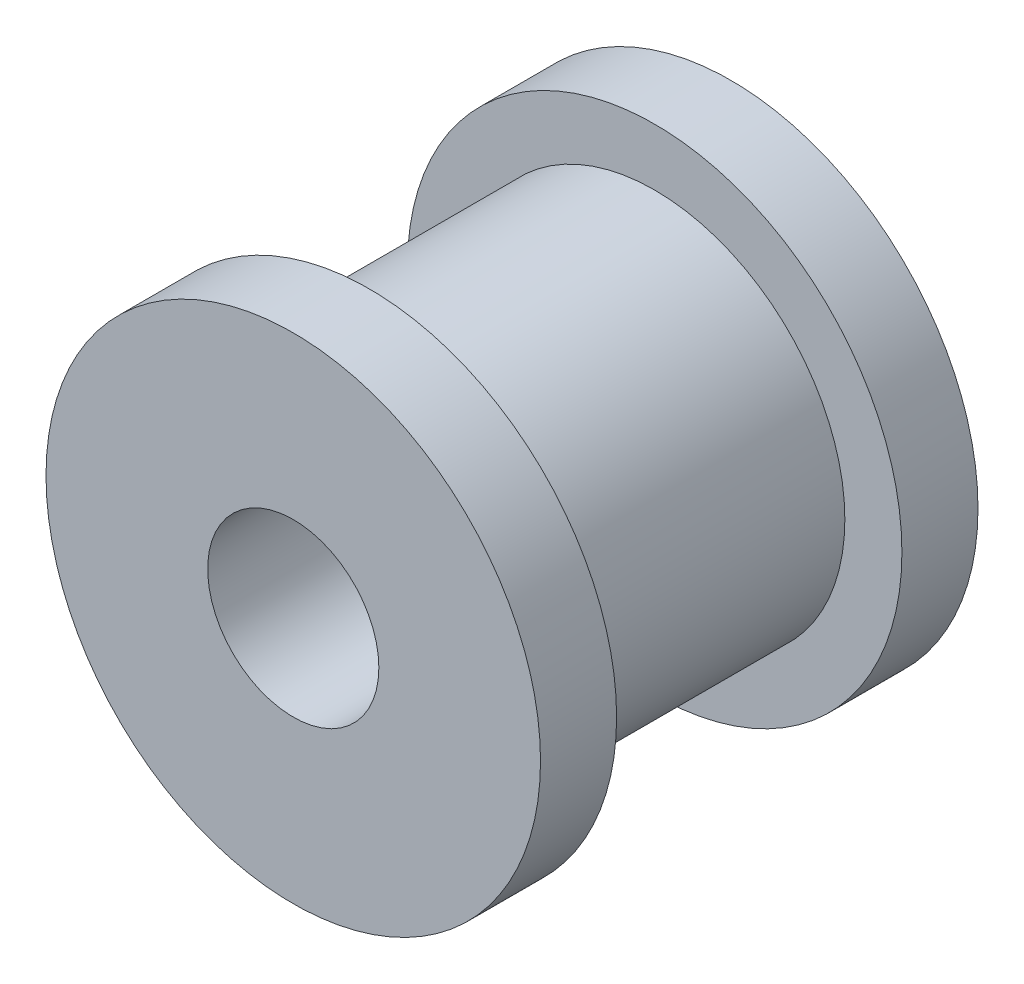
ISO-10303-21;
HEADER;
FILE_DESCRIPTION(('STEP AP214'),'2;1');
FILE_NAME('part.step','',(''),(''),'','','');
FILE_SCHEMA(('AUTOMOTIVE_DESIGN { 1 0 10303 214 1 1 1 1 }'));
ENDSEC;
DATA;
#1=APPLICATION_CONTEXT('core data for automotive mechanical design processes');
#2=APPLICATION_PROTOCOL_DEFINITION('international standard','automotive_design',2000,#1);
#3=PRODUCT_CONTEXT('',#1,'mechanical');
#4=PRODUCT('Part','Part','',(#3));
#5=PRODUCT_RELATED_PRODUCT_CATEGORY('part','',(#4));
#6=PRODUCT_DEFINITION_FORMATION('','',#4);
#7=PRODUCT_DEFINITION_CONTEXT('part definition',#1,'design');
#8=PRODUCT_DEFINITION('design','',#6,#7);
#9=PRODUCT_DEFINITION_SHAPE('','',#8);
#10=(LENGTH_UNIT() NAMED_UNIT(*) SI_UNIT(.MILLI.,.METRE.));
#11=(NAMED_UNIT(*) PLANE_ANGLE_UNIT() SI_UNIT($,.RADIAN.));
#12=(NAMED_UNIT(*) SI_UNIT($,.STERADIAN.) SOLID_ANGLE_UNIT());
#13=UNCERTAINTY_MEASURE_WITH_UNIT(LENGTH_MEASURE(1.E-05),#10,'distance_accuracy_value','');
#14=(GEOMETRIC_REPRESENTATION_CONTEXT(3) GLOBAL_UNCERTAINTY_ASSIGNED_CONTEXT((#13)) GLOBAL_UNIT_ASSIGNED_CONTEXT((#10,
#11,#12)) REPRESENTATION_CONTEXT('',''));
#15=CARTESIAN_POINT('',(0.,0.,0.));
#16=DIRECTION('',(0.,0.,1.));
#17=DIRECTION('',(1.,0.,0.));
#18=AXIS2_PLACEMENT_3D('',#15,#16,#17);
#19=CARTESIAN_POINT('',(0.,0.,7.5));
#20=DIRECTION('',(0.,0.,1.));
#21=DIRECTION('',(1.,0.,0.));
#22=AXIS2_PLACEMENT_3D('',#19,#20,#21);
#23=PLANE('',#22);
#24=CARTESIAN_POINT('',(0.,0.,7.5));
#25=DIRECTION('',(0.,0.,1.));
#26=DIRECTION('',(1.,0.,0.));
#27=AXIS2_PLACEMENT_3D('',#24,#25,#26);
#28=CIRCLE('',#27,5.);
#29=CARTESIAN_POINT('',(5.,0.,7.5));
#30=VERTEX_POINT('',#29);
#31=EDGE_CURVE('E11',#30,#30,#28,.T.);
#32=ORIENTED_EDGE('',*,*,#31,.T.);
#33=EDGE_LOOP('',(#32));
#34=FACE_BOUND('',#33,.T.);
#35=CARTESIAN_POINT('',(0.,0.,7.5));
#36=DIRECTION('',(0.,0.,1.));
#37=DIRECTION('',(1.,0.,0.));
#38=AXIS2_PLACEMENT_3D('',#35,#36,#37);
#39=CIRCLE('',#38,6.5);
#40=CARTESIAN_POINT('',(6.5,0.,7.5));
#41=VERTEX_POINT('',#40);
#42=EDGE_CURVE('E68',#41,#41,#39,.T.);
#43=ORIENTED_EDGE('',*,*,#42,.F.);
#44=EDGE_LOOP('',(#43));
#45=FACE_BOUND('',#44,.T.);
#46=ADVANCED_FACE('F47',(#34,#45),#23,.F.);
#47=CARTESIAN_POINT('',(0.,0.,7.5));
#48=DIRECTION('',(0.,0.,-1.));
#49=DIRECTION('',(-1.,0.,0.));
#50=AXIS2_PLACEMENT_3D('',#47,#48,#49);
#51=CYLINDRICAL_SURFACE('',#50,5.);
#52=ORIENTED_EDGE('',*,*,#31,.F.);
#53=EDGE_LOOP('',(#52));
#54=FACE_BOUND('',#53,.T.);
#55=CARTESIAN_POINT('',(0.,0.,0.));
#56=DIRECTION('',(0.,0.,1.));
#57=DIRECTION('',(1.,0.,0.));
#58=AXIS2_PLACEMENT_3D('',#55,#56,#57);
#59=CIRCLE('',#58,5.);
#60=CARTESIAN_POINT('',(5.,0.,0.));
#61=VERTEX_POINT('',#60);
#62=EDGE_CURVE('E56',#61,#61,#59,.T.);
#63=ORIENTED_EDGE('',*,*,#62,.T.);
#64=EDGE_LOOP('',(#63));
#65=FACE_BOUND('',#64,.T.);
#66=ADVANCED_FACE('F49',(#54,#65),#51,.T.);
#67=CARTESIAN_POINT('',(0.,0.,0.));
#68=DIRECTION('',(0.,0.,-1.));
#69=DIRECTION('',(-1.,0.,0.));
#70=AXIS2_PLACEMENT_3D('',#67,#68,#69);
#71=PLANE('',#70);
#72=ORIENTED_EDGE('',*,*,#62,.F.);
#73=EDGE_LOOP('',(#72));
#74=FACE_BOUND('',#73,.T.);
#75=CARTESIAN_POINT('',(0.,0.,0.));
#76=DIRECTION('',(0.,0.,-1.));
#77=DIRECTION('',(-1.,0.,0.));
#78=AXIS2_PLACEMENT_3D('',#75,#76,#77);
#79=CIRCLE('',#78,6.5);
#80=CARTESIAN_POINT('',(-6.5,0.,0.));
#81=VERTEX_POINT('',#80);
#82=EDGE_CURVE('E51',#81,#81,#79,.T.);
#83=ORIENTED_EDGE('',*,*,#82,.F.);
#84=EDGE_LOOP('',(#83));
#85=FACE_BOUND('',#84,.T.);
#86=ADVANCED_FACE('F90',(#74,#85),#71,.F.);
#87=CARTESIAN_POINT('',(0.,0.,9.5));
#88=DIRECTION('',(0.,0.,-1.));
#89=DIRECTION('',(-1.,0.,0.));
#90=AXIS2_PLACEMENT_3D('',#87,#88,#89);
#91=CYLINDRICAL_SURFACE('',#90,6.5);
#92=CARTESIAN_POINT('',(0.,0.,-2.));
#93=DIRECTION('',(0.,0.,-1.));
#94=DIRECTION('',(-1.,0.,0.));
#95=AXIS2_PLACEMENT_3D('',#92,#93,#94);
#96=CIRCLE('',#95,6.5);
#97=CARTESIAN_POINT('',(-6.5,0.,-2.));
#98=VERTEX_POINT('',#97);
#99=EDGE_CURVE('E75',#98,#98,#96,.T.);
#100=ORIENTED_EDGE('',*,*,#99,.F.);
#101=EDGE_LOOP('',(#100));
#102=FACE_BOUND('',#101,.T.);
#103=ORIENTED_EDGE('',*,*,#82,.T.);
#104=EDGE_LOOP('',(#103));
#105=FACE_BOUND('',#104,.T.);
#106=ADVANCED_FACE('F88',(#102,#105),#91,.T.);
#107=CARTESIAN_POINT('',(0.,0.,9.5));
#108=DIRECTION('',(0.,0.,1.));
#109=DIRECTION('',(1.,0.,0.));
#110=AXIS2_PLACEMENT_3D('',#107,#108,#109);
#111=PLANE('',#110);
#112=CARTESIAN_POINT('',(0.,0.,9.5));
#113=DIRECTION('',(0.,0.,1.));
#114=DIRECTION('',(1.,0.,0.));
#115=AXIS2_PLACEMENT_3D('',#112,#113,#114);
#116=CIRCLE('',#115,2.25);
#117=CARTESIAN_POINT('',(2.25,0.,9.5));
#118=VERTEX_POINT('',#117);
#119=EDGE_CURVE('E64',#118,#118,#116,.T.);
#120=ORIENTED_EDGE('',*,*,#119,.F.);
#121=EDGE_LOOP('',(#120));
#122=FACE_BOUND('',#121,.T.);
#123=CARTESIAN_POINT('',(0.,0.,9.5));
#124=DIRECTION('',(0.,0.,-1.));
#125=DIRECTION('',(-1.,0.,0.));
#126=AXIS2_PLACEMENT_3D('',#123,#124,#125);
#127=CIRCLE('',#126,6.5);
#128=CARTESIAN_POINT('',(-6.5,0.,9.5));
#129=VERTEX_POINT('',#128);
#130=EDGE_CURVE('E79',#129,#129,#127,.T.);
#131=ORIENTED_EDGE('',*,*,#130,.F.);
#132=EDGE_LOOP('',(#131));
#133=FACE_BOUND('',#132,.T.);
#134=ADVANCED_FACE('F98',(#122,#133),#111,.T.);
#135=CARTESIAN_POINT('',(0.,0.,-2.));
#136=DIRECTION('',(0.,0.,-1.));
#137=DIRECTION('',(-1.,0.,0.));
#138=AXIS2_PLACEMENT_3D('',#135,#136,#137);
#139=PLANE('',#138);
#140=CARTESIAN_POINT('',(0.,0.,-2.));
#141=DIRECTION('',(0.,0.,1.));
#142=DIRECTION('',(1.,0.,0.));
#143=AXIS2_PLACEMENT_3D('',#140,#141,#142);
#144=CIRCLE('',#143,2.25);
#145=CARTESIAN_POINT('',(2.25,0.,-2.));
#146=VERTEX_POINT('',#145);
#147=EDGE_CURVE('E62',#146,#146,#144,.T.);
#148=ORIENTED_EDGE('',*,*,#147,.T.);
#149=EDGE_LOOP('',(#148));
#150=FACE_BOUND('',#149,.T.);
#151=ORIENTED_EDGE('',*,*,#99,.T.);
#152=EDGE_LOOP('',(#151));
#153=FACE_BOUND('',#152,.T.);
#154=ADVANCED_FACE('F111',(#150,#153),#139,.T.);
#155=CARTESIAN_POINT('',(0.,0.,-2.));
#156=DIRECTION('',(0.,0.,1.));
#157=DIRECTION('',(1.,0.,0.));
#158=AXIS2_PLACEMENT_3D('',#155,#156,#157);
#159=CYLINDRICAL_SURFACE('',#158,2.25);
#160=ORIENTED_EDGE('',*,*,#147,.F.);
#161=EDGE_LOOP('',(#160));
#162=FACE_BOUND('',#161,.T.);
#163=ORIENTED_EDGE('',*,*,#119,.T.);
#164=EDGE_LOOP('',(#163));
#165=FACE_BOUND('',#164,.T.);
#166=ADVANCED_FACE('F116',(#162,#165),#159,.F.);
#167=ORIENTED_EDGE('',*,*,#130,.T.);
#168=EDGE_LOOP('',(#167));
#169=FACE_BOUND('',#168,.T.);
#170=ORIENTED_EDGE('',*,*,#42,.T.);
#171=EDGE_LOOP('',(#170));
#172=FACE_BOUND('',#171,.T.);
#173=ADVANCED_FACE('F101',(#169,#172),#91,.T.);
#174=CLOSED_SHELL('',(#46,#66,#86,#106,#134,#154,#166,#173));
#175=MANIFOLD_SOLID_BREP('B2',#174);
#176=ADVANCED_BREP_SHAPE_REPRESENTATION('',(#18,#175),#14);
#177=SHAPE_DEFINITION_REPRESENTATION(#9,#176);
ENDSEC;
END-ISO-10303-21;
